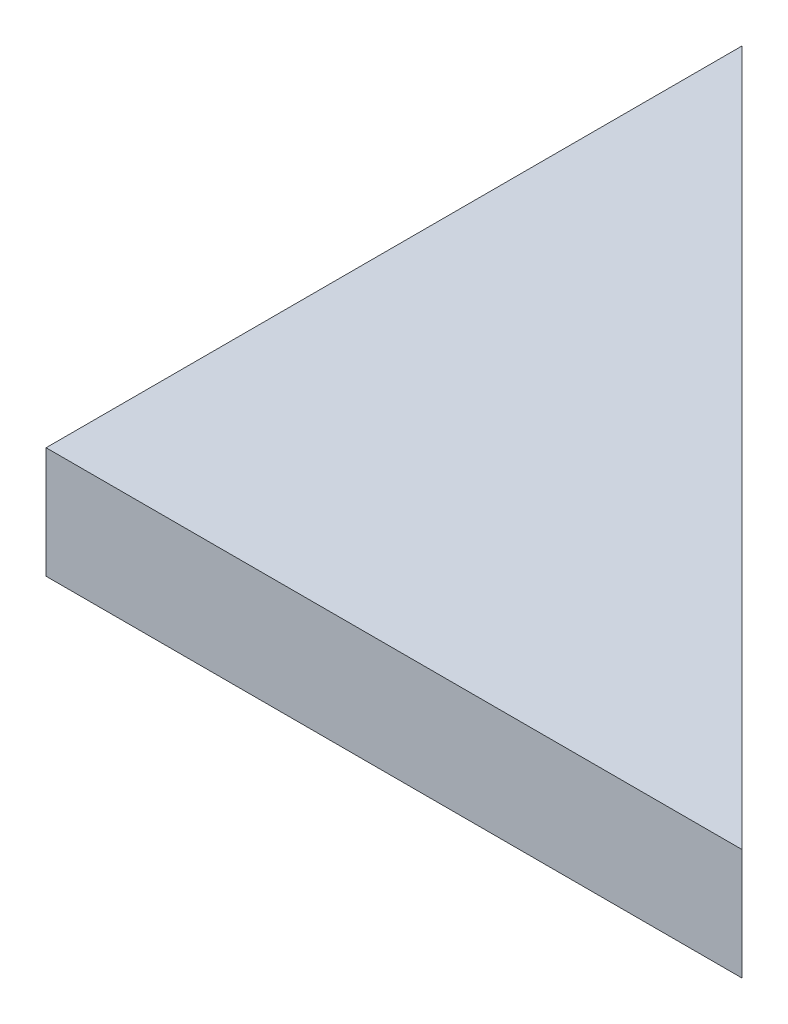
ISO-10303-21;
HEADER;
FILE_DESCRIPTION(('STEP AP214'),'2;1');
FILE_NAME('part.step','',(''),(''),'','','');
FILE_SCHEMA(('AUTOMOTIVE_DESIGN { 1 0 10303 214 1 1 1 1 }'));
ENDSEC;
DATA;
#1=APPLICATION_CONTEXT('core data for automotive mechanical design processes');
#2=APPLICATION_PROTOCOL_DEFINITION('international standard','automotive_design',2000,#1);
#3=PRODUCT_CONTEXT('',#1,'mechanical');
#4=PRODUCT('Part','Part','',(#3));
#5=PRODUCT_RELATED_PRODUCT_CATEGORY('part','',(#4));
#6=PRODUCT_DEFINITION_FORMATION('','',#4);
#7=PRODUCT_DEFINITION_CONTEXT('part definition',#1,'design');
#8=PRODUCT_DEFINITION('design','',#6,#7);
#9=PRODUCT_DEFINITION_SHAPE('','',#8);
#10=(LENGTH_UNIT() NAMED_UNIT(*) SI_UNIT(.MILLI.,.METRE.));
#11=(NAMED_UNIT(*) PLANE_ANGLE_UNIT() SI_UNIT($,.RADIAN.));
#12=(NAMED_UNIT(*) SI_UNIT($,.STERADIAN.) SOLID_ANGLE_UNIT());
#13=UNCERTAINTY_MEASURE_WITH_UNIT(LENGTH_MEASURE(1.E-05),#10,'distance_accuracy_value','');
#14=(GEOMETRIC_REPRESENTATION_CONTEXT(3) GLOBAL_UNCERTAINTY_ASSIGNED_CONTEXT((#13)) GLOBAL_UNIT_ASSIGNED_CONTEXT((#10,
#11,#12)) REPRESENTATION_CONTEXT('',''));
#15=CARTESIAN_POINT('',(0.,0.,0.));
#16=DIRECTION('',(0.,0.,1.));
#17=DIRECTION('',(1.,0.,0.));
#18=AXIS2_PLACEMENT_3D('',#15,#16,#17);
#19=CARTESIAN_POINT('',(0.,4.,0.));
#20=DIRECTION('',(0.,0.,-1.));
#21=DIRECTION('',(-1.,0.,0.));
#22=AXIS2_PLACEMENT_3D('',#19,#20,#21);
#23=PLANE('',#22);
#24=DIRECTION('',(1.,0.,0.));
#25=VECTOR('',#24,1.);
#26=CARTESIAN_POINT('',(0.,0.,0.));
#27=LINE('',#26,#25);
#28=CARTESIAN_POINT('',(0.,0.,0.));
#29=VERTEX_POINT('',#28);
#30=CARTESIAN_POINT('',(25.,0.,0.));
#31=VERTEX_POINT('',#30);
#32=EDGE_CURVE('E78',#29,#31,#27,.T.);
#33=ORIENTED_EDGE('',*,*,#32,.T.);
#34=DIRECTION('',(0.,-1.,0.));
#35=VECTOR('',#34,1.);
#36=CARTESIAN_POINT('',(25.,4.,0.));
#37=LINE('',#36,#35);
#38=CARTESIAN_POINT('',(25.,4.,0.));
#39=VERTEX_POINT('',#38);
#40=EDGE_CURVE('E11',#39,#31,#37,.T.);
#41=ORIENTED_EDGE('',*,*,#40,.F.);
#42=DIRECTION('',(1.,0.,0.));
#43=VECTOR('',#42,1.);
#44=CARTESIAN_POINT('',(0.,4.,0.));
#45=LINE('',#44,#43);
#46=CARTESIAN_POINT('',(0.,4.,0.));
#47=VERTEX_POINT('',#46);
#48=EDGE_CURVE('E71',#47,#39,#45,.T.);
#49=ORIENTED_EDGE('',*,*,#48,.F.);
#50=DIRECTION('',(0.,-1.,0.));
#51=VECTOR('',#50,1.);
#52=CARTESIAN_POINT('',(0.,4.,0.));
#53=LINE('',#52,#51);
#54=EDGE_CURVE('E79',#47,#29,#53,.T.);
#55=ORIENTED_EDGE('',*,*,#54,.T.);
#56=EDGE_LOOP('',(#33,#41,#49,#55));
#57=FACE_BOUND('',#56,.T.);
#58=ADVANCED_FACE('F31',(#57),#23,.F.);
#59=CARTESIAN_POINT('',(0.,4.,-25.));
#60=DIRECTION('',(-0.707106781186547,0.,0.707106781186547));
#61=DIRECTION('',(0.707106781186548,0.,0.707106781186548));
#62=AXIS2_PLACEMENT_3D('',#59,#60,#61);
#63=PLANE('',#62);
#64=DIRECTION('',(-0.707106781186547,0.,-0.707106781186547));
#65=VECTOR('',#64,1.);
#66=CARTESIAN_POINT('',(0.,0.,-25.));
#67=LINE('',#66,#65);
#68=CARTESIAN_POINT('',(0.,0.,-25.));
#69=VERTEX_POINT('',#68);
#70=EDGE_CURVE('E59',#31,#69,#67,.T.);
#71=ORIENTED_EDGE('',*,*,#70,.T.);
#72=DIRECTION('',(0.,-1.,0.));
#73=VECTOR('',#72,1.);
#74=CARTESIAN_POINT('',(0.,4.,-25.));
#75=LINE('',#74,#73);
#76=CARTESIAN_POINT('',(0.,4.,-25.));
#77=VERTEX_POINT('',#76);
#78=EDGE_CURVE('E39',#77,#69,#75,.T.);
#79=ORIENTED_EDGE('',*,*,#78,.F.);
#80=DIRECTION('',(-0.707106781186547,0.,-0.707106781186547));
#81=VECTOR('',#80,1.);
#82=CARTESIAN_POINT('',(0.,4.,-25.));
#83=LINE('',#82,#81);
#84=EDGE_CURVE('E67',#39,#77,#83,.T.);
#85=ORIENTED_EDGE('',*,*,#84,.F.);
#86=ORIENTED_EDGE('',*,*,#40,.T.);
#87=EDGE_LOOP('',(#71,#79,#85,#86));
#88=FACE_BOUND('',#87,.T.);
#89=ADVANCED_FACE('F68',(#88),#63,.F.);
#90=CARTESIAN_POINT('',(0.,4.,0.));
#91=DIRECTION('',(1.,0.,0.));
#92=DIRECTION('',(0.,0.,-1.));
#93=AXIS2_PLACEMENT_3D('',#90,#91,#92);
#94=PLANE('',#93);
#95=DIRECTION('',(0.,0.,1.));
#96=VECTOR('',#95,1.);
#97=CARTESIAN_POINT('',(0.,0.,0.));
#98=LINE('',#97,#96);
#99=EDGE_CURVE('E64',#69,#29,#98,.T.);
#100=ORIENTED_EDGE('',*,*,#99,.T.);
#101=ORIENTED_EDGE('',*,*,#54,.F.);
#102=DIRECTION('',(0.,0.,1.));
#103=VECTOR('',#102,1.);
#104=CARTESIAN_POINT('',(0.,4.,0.));
#105=LINE('',#104,#103);
#106=EDGE_CURVE('E47',#77,#47,#105,.T.);
#107=ORIENTED_EDGE('',*,*,#106,.F.);
#108=ORIENTED_EDGE('',*,*,#78,.T.);
#109=EDGE_LOOP('',(#100,#101,#107,#108));
#110=FACE_BOUND('',#109,.T.);
#111=ADVANCED_FACE('F86',(#110),#94,.F.);
#112=CARTESIAN_POINT('',(0.,4.,0.));
#113=DIRECTION('',(0.,1.,0.));
#114=DIRECTION('',(0.,0.,1.));
#115=AXIS2_PLACEMENT_3D('',#112,#113,#114);
#116=PLANE('',#115);
#117=ORIENTED_EDGE('',*,*,#48,.T.);
#118=ORIENTED_EDGE('',*,*,#84,.T.);
#119=ORIENTED_EDGE('',*,*,#106,.T.);
#120=EDGE_LOOP('',(#117,#118,#119));
#121=FACE_BOUND('',#120,.T.);
#122=ADVANCED_FACE('F74',(#121),#116,.T.);
#123=CARTESIAN_POINT('',(0.,0.,0.));
#124=DIRECTION('',(0.,1.,0.));
#125=DIRECTION('',(0.,0.,1.));
#126=AXIS2_PLACEMENT_3D('',#123,#124,#125);
#127=PLANE('',#126);
#128=ORIENTED_EDGE('',*,*,#32,.F.);
#129=ORIENTED_EDGE('',*,*,#99,.F.);
#130=ORIENTED_EDGE('',*,*,#70,.F.);
#131=EDGE_LOOP('',(#128,#129,#130));
#132=FACE_BOUND('',#131,.T.);
#133=ADVANCED_FACE('F87',(#132),#127,.F.);
#134=CLOSED_SHELL('',(#58,#89,#111,#122,#133));
#135=MANIFOLD_SOLID_BREP('B2',#134);
#136=ADVANCED_BREP_SHAPE_REPRESENTATION('',(#18,#135),#14);
#137=SHAPE_DEFINITION_REPRESENTATION(#9,#136);
ENDSEC;
END-ISO-10303-21;
